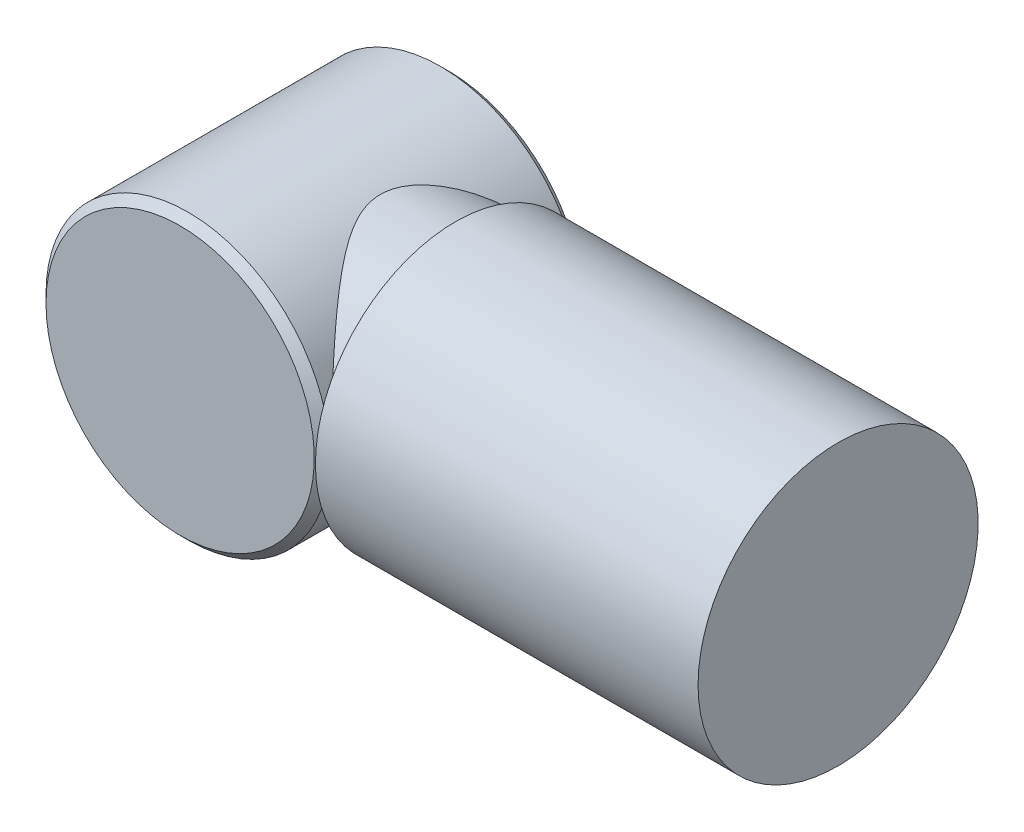
ISO-10303-21;
HEADER;
FILE_DESCRIPTION(('STEP AP214'),'2;1');
FILE_NAME('part.step','',(''),(''),'','','');
FILE_SCHEMA(('AUTOMOTIVE_DESIGN { 1 0 10303 214 1 1 1 1 }'));
ENDSEC;
DATA;
#1=APPLICATION_CONTEXT('core data for automotive mechanical design processes');
#2=APPLICATION_PROTOCOL_DEFINITION('international standard','automotive_design',2000,#1);
#3=PRODUCT_CONTEXT('',#1,'mechanical');
#4=PRODUCT('Part','Part','',(#3));
#5=PRODUCT_RELATED_PRODUCT_CATEGORY('part','',(#4));
#6=PRODUCT_DEFINITION_FORMATION('','',#4);
#7=PRODUCT_DEFINITION_CONTEXT('part definition',#1,'design');
#8=PRODUCT_DEFINITION('design','',#6,#7);
#9=PRODUCT_DEFINITION_SHAPE('','',#8);
#10=(LENGTH_UNIT() NAMED_UNIT(*) SI_UNIT(.MILLI.,.METRE.));
#11=(NAMED_UNIT(*) PLANE_ANGLE_UNIT() SI_UNIT($,.RADIAN.));
#12=(NAMED_UNIT(*) SI_UNIT($,.STERADIAN.) SOLID_ANGLE_UNIT());
#13=UNCERTAINTY_MEASURE_WITH_UNIT(LENGTH_MEASURE(1.E-05),#10,'distance_accuracy_value','');
#14=(GEOMETRIC_REPRESENTATION_CONTEXT(3) GLOBAL_UNCERTAINTY_ASSIGNED_CONTEXT((#13)) GLOBAL_UNIT_ASSIGNED_CONTEXT((#10,
#11,#12)) REPRESENTATION_CONTEXT('',''));
#15=CARTESIAN_POINT('',(0.,0.,0.));
#16=DIRECTION('',(0.,0.,1.));
#17=DIRECTION('',(1.,0.,0.));
#18=AXIS2_PLACEMENT_3D('',#15,#16,#17);
#19=CARTESIAN_POINT('',(0.,0.,-9.));
#20=DIRECTION('',(0.,0.,-1.));
#21=DIRECTION('',(-1.,0.,0.));
#22=AXIS2_PLACEMENT_3D('',#19,#20,#21);
#23=PLANE('',#22);
#24=CARTESIAN_POINT('',(0.,0.,-9.));
#25=DIRECTION('',(0.,0.,1.));
#26=DIRECTION('',(1.,0.,0.));
#27=AXIS2_PLACEMENT_3D('',#24,#25,#26);
#28=CIRCLE('',#27,14.5);
#29=CARTESIAN_POINT('',(14.5,0.,-9.));
#30=VERTEX_POINT('',#29);
#31=EDGE_CURVE('E20',#30,#30,#28,.T.);
#32=ORIENTED_EDGE('',*,*,#31,.F.);
#33=EDGE_LOOP('',(#32));
#34=FACE_BOUND('',#33,.T.);
#35=ADVANCED_FACE('F17',(#34),#23,.T.);
#36=CARTESIAN_POINT('',(0.,0.,-8.5));
#37=DIRECTION('',(0.,0.,1.));
#38=DIRECTION('',(1.,0.,0.));
#39=AXIS2_PLACEMENT_3D('',#36,#37,#38);
#40=CONICAL_SURFACE('',#39,15.,0.78539816339744);
#41=CARTESIAN_POINT('',(0.,0.,-8.5));
#42=DIRECTION('',(0.,0.,1.));
#43=DIRECTION('',(1.,0.,0.));
#44=AXIS2_PLACEMENT_3D('',#41,#42,#43);
#45=CIRCLE('',#44,15.);
#46=CARTESIAN_POINT('',(15.,0.,-8.5));
#47=VERTEX_POINT('',#46);
#48=EDGE_CURVE('E147',#47,#47,#45,.T.);
#49=ORIENTED_EDGE('',*,*,#48,.F.);
#50=EDGE_LOOP('',(#49));
#51=FACE_BOUND('',#50,.T.);
#52=ORIENTED_EDGE('',*,*,#31,.T.);
#53=EDGE_LOOP('',(#52));
#54=FACE_BOUND('',#53,.T.);
#55=ADVANCED_FACE('F188',(#51,#54),#40,.T.);
#56=CARTESIAN_POINT('',(0.,0.,-9.));
#57=DIRECTION('',(0.,0.,1.));
#58=DIRECTION('',(1.,0.,0.));
#59=AXIS2_PLACEMENT_3D('',#56,#57,#58);
#60=CYLINDRICAL_SURFACE('',#59,15.);
#61=CARTESIAN_POINT('',(0.,0.,-2.));
#62=DIRECTION('',(0.,0.,1.));
#63=DIRECTION('',(1.,0.,0.));
#64=AXIS2_PLACEMENT_3D('',#61,#62,#63);
#65=CIRCLE('',#64,15.);
#66=CARTESIAN_POINT('',(15.,0.,-2.));
#67=VERTEX_POINT('',#66);
#68=EDGE_CURVE('E145',#67,#67,#65,.T.);
#69=ORIENTED_EDGE('',*,*,#68,.F.);
#70=EDGE_LOOP('',(#69));
#71=FACE_BOUND('',#70,.T.);
#72=ORIENTED_EDGE('',*,*,#48,.T.);
#73=EDGE_LOOP('',(#72));
#74=FACE_BOUND('',#73,.T.);
#75=ADVANCED_FACE('F182',(#71,#74),#60,.T.);
#76=CARTESIAN_POINT('',(0.,0.,-2.));
#77=DIRECTION('',(0.,0.,-1.));
#78=DIRECTION('',(-1.,0.,0.));
#79=AXIS2_PLACEMENT_3D('',#76,#77,#78);
#80=PLANE('',#79);
#81=CARTESIAN_POINT('',(0.,0.,-2.));
#82=DIRECTION('',(0.,0.,-1.));
#83=DIRECTION('',(-1.,0.,0.));
#84=AXIS2_PLACEMENT_3D('',#81,#82,#83);
#85=CIRCLE('',#84,17.);
#86=CARTESIAN_POINT('',(-17.,0.,-2.));
#87=VERTEX_POINT('',#86);
#88=EDGE_CURVE('E143',#87,#87,#85,.F.);
#89=ORIENTED_EDGE('',*,*,#88,.F.);
#90=EDGE_LOOP('',(#89));
#91=FACE_BOUND('',#90,.T.);
#92=ORIENTED_EDGE('',*,*,#68,.T.);
#93=EDGE_LOOP('',(#92));
#94=FACE_BOUND('',#93,.T.);
#95=ADVANCED_FACE('F177',(#91,#94),#80,.T.);
#96=CARTESIAN_POINT('',(0.,0.,0.5));
#97=DIRECTION('',(0.,0.,-1.));
#98=DIRECTION('',(-1.,0.,0.));
#99=AXIS2_PLACEMENT_3D('',#96,#97,#98);
#100=CYLINDRICAL_SURFACE('',#99,17.);
#101=CARTESIAN_POINT('',(0.,0.,0.));
#102=DIRECTION('',(0.,0.,-1.));
#103=DIRECTION('',(-1.,0.,0.));
#104=AXIS2_PLACEMENT_3D('',#101,#102,#103);
#105=CIRCLE('',#104,17.);
#106=CARTESIAN_POINT('',(-17.,0.,0.));
#107=VERTEX_POINT('',#106);
#108=EDGE_CURVE('E140',#107,#107,#105,.T.);
#109=ORIENTED_EDGE('',*,*,#108,.T.);
#110=EDGE_LOOP('',(#109));
#111=FACE_BOUND('',#110,.T.);
#112=ORIENTED_EDGE('',*,*,#88,.T.);
#113=EDGE_LOOP('',(#112));
#114=FACE_BOUND('',#113,.T.);
#115=ADVANCED_FACE('F174',(#111,#114),#100,.T.);
#116=CARTESIAN_POINT('',(0.,0.,68.));
#117=DIRECTION('',(0.,0.,1.));
#118=DIRECTION('',(1.,0.,0.));
#119=AXIS2_PLACEMENT_3D('',#116,#117,#118);
#120=PLANE('',#119);
#121=CARTESIAN_POINT('',(0.,0.,68.));
#122=DIRECTION('',(0.,0.,-1.));
#123=DIRECTION('',(-1.,0.,0.));
#124=AXIS2_PLACEMENT_3D('',#121,#122,#123);
#125=CIRCLE('',#124,34.);
#126=CARTESIAN_POINT('',(-34.,0.,68.));
#127=VERTEX_POINT('',#126);
#128=EDGE_CURVE('E73',#127,#127,#125,.T.);
#129=ORIENTED_EDGE('',*,*,#128,.F.);
#130=EDGE_LOOP('',(#129));
#131=FACE_BOUND('',#130,.T.);
#132=ADVANCED_FACE('F171',(#131),#120,.T.);
#133=CARTESIAN_POINT('',(0.,0.,0.));
#134=DIRECTION('',(0.,0.,1.));
#135=DIRECTION('',(1.,0.,0.));
#136=AXIS2_PLACEMENT_3D('',#133,#134,#135);
#137=PLANE('',#136);
#138=CARTESIAN_POINT('',(0.,0.,0.));
#139=DIRECTION('',(0.,0.,1.));
#140=DIRECTION('',(1.,0.,0.));
#141=AXIS2_PLACEMENT_3D('',#138,#139,#140);
#142=CIRCLE('',#141,34.);
#143=CARTESIAN_POINT('',(34.,0.,0.));
#144=VERTEX_POINT('',#143);
#145=EDGE_CURVE('E137',#144,#144,#142,.T.);
#146=ORIENTED_EDGE('',*,*,#145,.F.);
#147=EDGE_LOOP('',(#146));
#148=FACE_BOUND('',#147,.T.);
#149=ORIENTED_EDGE('',*,*,#108,.F.);
#150=EDGE_LOOP('',(#149));
#151=FACE_BOUND('',#150,.T.);
#152=ADVANCED_FACE('F127',(#148,#151),#137,.F.);
#153=CARTESIAN_POINT('',(0.,0.,169.823376490863));
#154=DIRECTION('',(0.,0.,-1.));
#155=DIRECTION('',(-1.,0.,0.));
#156=AXIS2_PLACEMENT_3D('',#153,#154,#155);
#157=CYLINDRICAL_SURFACE('',#156,36.);
#158=CARTESIAN_POINT('',(35.5,-5.97913037155069,65.1364438192363));
#159=CARTESIAN_POINT('',(35.4310175256847,-6.38877942934124,65.0585419907403));
#160=CARTESIAN_POINT('',(35.3551676007641,-6.79575562975238,64.9728274435998));
#161=CARTESIAN_POINT('',(35.1902955634896,-7.60346750996772,64.7863128090172));
#162=CARTESIAN_POINT('',(35.1012756096363,-8.00420420052294,64.6855151935825));
#163=CARTESIAN_POINT('',(34.910734654101,-8.79812953910063,64.4694974063824));
#164=CARTESIAN_POINT('',(34.8092310478099,-9.19132782732697,64.3542973001972));
#165=CARTESIAN_POINT('',(34.5942468791537,-9.97002002836648,64.1099536847948));
#166=CARTESIAN_POINT('',(34.4807658668352,-10.3555136510921,63.9808096517441));
#167=CARTESIAN_POINT('',(34.1255412700314,-11.4923180458015,63.5758984652346));
#168=CARTESIAN_POINT('',(33.8671564156666,-12.2316164565677,63.2805484972162));
#169=CARTESIAN_POINT('',(33.310991166398,-13.6739136067002,62.6421267027277));
#170=CARTESIAN_POINT('',(33.0131975563298,-14.3769000589396,62.2990388660503));
#171=CARTESIAN_POINT('',(32.3853082141862,-15.740129382208,61.571878941208));
#172=CARTESIAN_POINT('',(32.0554086837098,-16.4005953861549,61.1880546337645));
#173=CARTESIAN_POINT('',(31.3669474567568,-17.6817276213,60.3820040555234));
#174=CARTESIAN_POINT('',(31.008388170533,-18.3023971914376,59.9597810136048));
#175=CARTESIAN_POINT('',(30.2663927569661,-19.5050257024758,59.0793396058032));
#176=CARTESIAN_POINT('',(29.8828922785005,-20.0868759710964,58.6210274280811));
#177=CARTESIAN_POINT('',(29.0965223974903,-21.2099597973596,57.6724420287199));
#178=CARTESIAN_POINT('',(28.6936517695677,-21.7511907798182,57.1821667843602));
#179=CARTESIAN_POINT('',(27.7974055809081,-22.8893215606762,56.078956081794));
#180=CARTESIAN_POINT('',(27.301034057999,-23.4780974155388,55.4600672711468));
#181=CARTESIAN_POINT('',(26.2949084696467,-24.5997035387288,54.183571959859));
#182=CARTESIAN_POINT('',(25.7851520103493,-25.1325237131847,53.5259585069402));
#183=CARTESIAN_POINT('',(24.7603652159167,-26.1427206875148,52.1735103097067));
#184=CARTESIAN_POINT('',(24.2453353897664,-26.620102784384,51.4786791307552));
#185=CARTESIAN_POINT('',(23.2191743204786,-27.5197191419385,50.0516546163484));
#186=CARTESIAN_POINT('',(22.7080421884141,-27.9419663540659,49.3194701117676));
#187=CARTESIAN_POINT('',(21.8390252814642,-28.6229452573275,48.0215556129766));
#188=CARTESIAN_POINT('',(21.4774902752872,-28.8947978643374,47.4651232319967));
#189=CARTESIAN_POINT('',(20.7682338891007,-29.4087079465983,46.329974990839));
#190=CARTESIAN_POINT('',(20.4205135176079,-29.6507632492387,45.751257509822));
#191=CARTESIAN_POINT('',(19.7464865935054,-30.1038357563882,44.5700840329225));
#192=CARTESIAN_POINT('',(19.4201653337671,-30.3148744044293,43.9676448060274));
#193=CARTESIAN_POINT('',(18.7985689443437,-30.7042074480077,42.7370605676549));
#194=CARTESIAN_POINT('',(18.5032819779048,-30.8825143472396,42.1089254847266));
#195=CARTESIAN_POINT('',(17.8569909915881,-31.2620221478731,40.591827505797));
#196=CARTESIAN_POINT('',(17.5244343516389,-31.4481974628081,39.6906618651252));
#197=CARTESIAN_POINT('',(17.1173827498374,-31.6704822512879,38.3042541845783));
#198=CARTESIAN_POINT('',(16.9970740888855,-31.7350429909425,37.8368483236021));
#199=CARTESIAN_POINT('',(16.7921151588252,-31.8439684043953,36.8918152667395));
#200=CARTESIAN_POINT('',(16.7074626596727,-31.8883343412515,36.41418871205));
#201=CARTESIAN_POINT('',(16.5775359613401,-31.9560770888207,35.4457625869716));
#202=CARTESIAN_POINT('',(16.532781979815,-31.9791767417786,34.9548726052989));
#203=CARTESIAN_POINT('',(16.4873148709023,-32.0026425818751,33.9705112955261));
#204=CARTESIAN_POINT('',(16.4865983159504,-32.0030105382893,33.477040171314));
#205=CARTESIAN_POINT('',(16.5292646257073,-31.9809936671907,32.4921537476757));
#206=CARTESIAN_POINT('',(16.5726831175674,-31.958590458102,32.00074043116));
#207=CARTESIAN_POINT('',(16.7009557776369,-31.8917419970454,31.0248972799066));
#208=CARTESIAN_POINT('',(16.7858179915253,-31.8472924650873,30.540468819982));
#209=CARTESIAN_POINT('',(17.0100243960704,-31.7281856756891,29.4998150265092));
#210=CARTESIAN_POINT('',(17.1562152094622,-31.6496557717849,28.9455207655258));
#211=CARTESIAN_POINT('',(17.4900981784619,-31.4663720541779,27.8541475569318));
#212=CARTESIAN_POINT('',(17.6778024711394,-31.3616105701048,27.3170736966428));
#213=CARTESIAN_POINT('',(18.086562483714,-31.1276701080969,26.2594027434689));
#214=CARTESIAN_POINT('',(18.3077218187909,-30.9984149438643,25.7388631413465));
#215=CARTESIAN_POINT('',(18.7753964500439,-30.7174042561472,24.7154099462918));
#216=CARTESIAN_POINT('',(19.0219225885443,-30.5656390990644,24.212504014538));
#217=CARTESIAN_POINT('',(19.5107253741971,-30.2557040791972,23.2684986729692));
#218=CARTESIAN_POINT('',(19.7513547494737,-30.0993675210959,22.8259339512176));
#219=CARTESIAN_POINT('',(20.2444839013776,-29.7699308766384,21.9540061599194));
#220=CARTESIAN_POINT('',(20.496981503635,-29.5968338548432,21.5246406958036));
#221=CARTESIAN_POINT('',(21.0109690609056,-29.2341957130897,20.6779395932756));
#222=CARTESIAN_POINT('',(21.2724657795389,-29.0446420540856,20.2606134564911));
#223=CARTESIAN_POINT('',(21.801713995023,-28.6495087478457,19.4376724585315));
#224=CARTESIAN_POINT('',(22.0694657520972,-28.4439284330312,19.0320580861669));
#225=CARTESIAN_POINT('',(22.609403576665,-28.0166652201056,18.2315624922064));
#226=CARTESIAN_POINT('',(22.8815946926696,-27.7949628293564,17.8366950841467));
#227=CARTESIAN_POINT('',(23.4282689162089,-27.3357593910773,17.0578674099863));
#228=CARTESIAN_POINT('',(23.7027522055426,-27.0982570798007,16.67390801987));
#229=CARTESIAN_POINT('',(24.5269904759799,-26.3622605356405,15.5383561069369));
#230=CARTESIAN_POINT('',(25.077802118915,-25.8400669519655,14.8026974886068));
#231=CARTESIAN_POINT('',(26.2107072089075,-24.6920224453363,13.3224732275379));
#232=CARTESIAN_POINT('',(26.7921745947751,-24.061401842623,12.5811261927348));
#233=CARTESIAN_POINT('',(27.9339787226838,-22.7258629126223,11.1502139165205));
#234=CARTESIAN_POINT('',(28.4943105515283,-22.0209274527861,10.4606606786748));
#235=CARTESIAN_POINT('',(29.5813875928625,-20.5374241029562,9.13989668566544));
#236=CARTESIAN_POINT('',(30.1081928516126,-19.7589944313676,8.50858066006564));
#237=CARTESIAN_POINT('',(31.1176290417617,-18.1276619845829,7.31040280598437));
#238=CARTESIAN_POINT('',(31.6002834614057,-17.2747992852575,6.74350666677527));
#239=CARTESIAN_POINT('',(32.3733976191439,-15.762406561151,5.84190887236136));
#240=CARTESIAN_POINT('',(32.6781801159787,-15.1212960322564,5.48845512972165));
#241=CARTESIAN_POINT('',(33.2557942977883,-13.80466147985,4.82136198393556));
#242=CARTESIAN_POINT('',(33.5286250766065,-13.1291364811169,4.50772370994183));
#243=CARTESIAN_POINT('',(34.0371017992086,-11.748012780838,3.92510365565405));
#244=CARTESIAN_POINT('',(34.2728486302512,-11.0425025464646,3.65600060905108));
#245=CARTESIAN_POINT('',(34.7035963647316,-9.60332116437578,3.16553816809375));
#246=CARTESIAN_POINT('',(34.8986239167895,-8.86966880874604,2.9441475453994));
#247=CARTESIAN_POINT('',(35.1529937718316,-7.77163262604167,2.65592092800518));
#248=CARTESIAN_POINT('',(35.2296867047558,-7.4163469793477,2.56911074171488));
#249=CARTESIAN_POINT('',(35.372699989775,-6.70112422030838,2.40735998468529));
#250=CARTESIAN_POINT('',(35.4390231165455,-6.34118838022966,2.33241623874365));
#251=CARTESIAN_POINT('',(35.5,-5.97913037155071,2.26355618076371));
#252=B_SPLINE_CURVE_WITH_KNOTS('',3,(#158,#159,#160,#161,#162,#163,#164,#165,#166,#167,#168,
#169,#170,#171,#172,#173,#174,#175,#176,#177,#178,#179,#180,#181,#182,#183,#184,#185,#186,#187,
#188,#189,#190,#191,#192,#193,#194,#195,#196,#197,#198,#199,#200,#201,#202,#203,#204,#205,#206,
#207,#208,#209,#210,#211,#212,#213,#214,#215,#216,#217,#218,#219,#220,#221,#222,#223,#224,#225,
#226,#227,#228,#229,#230,#231,#232,#233,#234,#235,#236,#237,#238,#239,#240,#241,#242,#243,#244,
#245,#246,#247,#248,#249,#250,#251),.UNSPECIFIED.,.F.,.F.,(4,2,2,2,2,2,2,2,2,2,2,2,2,2,2,2,2,2,
2,2,2,2,2,2,2,2,2,2,2,2,2,2,2,2,2,2,2,2,2,2,2,2,2,2,2,2,4),(0.,1.26779220495994,
2.53537685493925,3.80121478237204,5.06710028029144,7.57447885947186,10.082700393051,
12.5764562300849,15.0700025653103,17.5702594731081,20.0706747586751,23.0319163998994,
25.9936913066267,28.9551829885647,31.9159777459346,34.0663141148165,36.2168071784007,
38.3658064217263,40.5139830202633,43.4387299464792,44.8980560125976,46.3572907945042,
47.835284766322,49.3131637013193,50.7922365732341,52.2715966992404,54.0046060167127,
55.7381226760426,57.4771225841751,59.2168688908478,60.7986201977461,62.3800828340691,
63.9627612140806,65.5455055546616,67.1301964153601,68.7150141793066,71.8830948335145,
75.2807823023488,78.6792547942322,82.071458577568,85.4618470834796,87.8387322867138,
90.2156848825223,92.5860547409414,94.9548684208563,96.0756330533994,97.196097284958),.UNSPECIFIED.);
#253=CARTESIAN_POINT('',(35.5,-5.9791303715507,65.1364438192363));
#254=VERTEX_POINT('',#253);
#255=CARTESIAN_POINT('',(35.5,-5.9791303715507,2.2635561807637));
#256=VERTEX_POINT('',#255);
#257=EDGE_CURVE('E75',#254,#256,#252,.T.);
#258=ORIENTED_EDGE('',*,*,#257,.F.);
#259=DIRECTION('',(0.,0.,-1.));
#260=VECTOR('',#259,1.);
#261=CARTESIAN_POINT('',(35.5,-5.9791303715507,169.823376490863));
#262=LINE('',#261,#260);
#263=CARTESIAN_POINT('',(35.5,-5.9791303715507,66.));
#264=VERTEX_POINT('',#263);
#265=EDGE_CURVE('E68',#254,#264,#262,.F.);
#266=ORIENTED_EDGE('',*,*,#265,.T.);
#267=CARTESIAN_POINT('',(0.,0.,66.));
#268=DIRECTION('',(0.,0.,-1.));
#269=DIRECTION('',(-1.,0.,0.));
#270=AXIS2_PLACEMENT_3D('',#267,#268,#269);
#271=CIRCLE('',#270,36.);
#272=CARTESIAN_POINT('',(35.5,5.9791303715507,66.));
#273=VERTEX_POINT('',#272);
#274=EDGE_CURVE('E64',#273,#264,#271,.F.);
#275=ORIENTED_EDGE('',*,*,#274,.F.);
#276=DIRECTION('',(0.,0.,-1.));
#277=VECTOR('',#276,1.);
#278=CARTESIAN_POINT('',(35.5,5.97913037155071,169.823376490863));
#279=LINE('',#278,#277);
#280=CARTESIAN_POINT('',(35.5,5.9791303715507,65.1364438192363));
#281=VERTEX_POINT('',#280);
#282=EDGE_CURVE('E56',#273,#281,#279,.T.);
#283=ORIENTED_EDGE('',*,*,#282,.T.);
#284=CARTESIAN_POINT('',(35.5,5.9791303715507,2.2635561807637));
#285=CARTESIAN_POINT('',(35.4310175256847,6.38877942934125,2.3414580092597));
#286=CARTESIAN_POINT('',(35.3551676007641,6.79575562975238,2.42717255640025));
#287=CARTESIAN_POINT('',(35.1902955634896,7.60346750996773,2.6136871909828));
#288=CARTESIAN_POINT('',(35.1012756096363,8.00420420052294,2.71448480641752));
#289=CARTESIAN_POINT('',(34.910734654101,8.79812953910064,2.93050259361756));
#290=CARTESIAN_POINT('',(34.8092310478099,9.19132782732697,3.04570269980284));
#291=CARTESIAN_POINT('',(34.5942468791537,9.97002002836648,3.29004631520519));
#292=CARTESIAN_POINT('',(34.4807658668352,10.3555136510921,3.41919034825594));
#293=CARTESIAN_POINT('',(34.1255412700314,11.4923180458015,3.82410153476537));
#294=CARTESIAN_POINT('',(33.8671564156666,12.2316164565677,4.11945150278379));
#295=CARTESIAN_POINT('',(33.310991166398,13.6739136067003,4.75787329727234));
#296=CARTESIAN_POINT('',(33.0131975563298,14.3769000589396,5.10096113394967));
#297=CARTESIAN_POINT('',(32.3853082141862,15.740129382208,5.82812105879203));
#298=CARTESIAN_POINT('',(32.0554086837098,16.4005953861549,6.21194536623546));
#299=CARTESIAN_POINT('',(31.3669474567568,17.6817276213,7.0179959444766));
#300=CARTESIAN_POINT('',(31.008388170533,18.3023971914376,7.44021898639517));
#301=CARTESIAN_POINT('',(30.2663927569661,19.5050257024758,8.32066039419685));
#302=CARTESIAN_POINT('',(29.8828922785005,20.0868759710964,8.77897257191887));
#303=CARTESIAN_POINT('',(29.0965223974903,21.2099597973596,9.72755797128009));
#304=CARTESIAN_POINT('',(28.6936517695677,21.7511907798182,10.2178332156398));
#305=CARTESIAN_POINT('',(27.7974055809081,22.8893215606762,11.321043918206));
#306=CARTESIAN_POINT('',(27.301034057999,23.4780974155388,11.9399327288533));
#307=CARTESIAN_POINT('',(26.2949084696467,24.5997035387288,13.216428040141));
#308=CARTESIAN_POINT('',(25.7851520103493,25.1325237131847,13.8740414930598));
#309=CARTESIAN_POINT('',(24.7603652159167,26.1427206875148,15.2264896902933));
#310=CARTESIAN_POINT('',(24.2453353897664,26.620102784384,15.9213208692448));
#311=CARTESIAN_POINT('',(23.2191743204786,27.5197191419385,17.3483453836516));
#312=CARTESIAN_POINT('',(22.7080421884141,27.9419663540659,18.0805298882324));
#313=CARTESIAN_POINT('',(21.8390252814642,28.6229452573275,19.3784443870234));
#314=CARTESIAN_POINT('',(21.4774902752872,28.8947978643374,19.9348767680033));
#315=CARTESIAN_POINT('',(20.7682338891007,29.4087079465983,21.070025009161));
#316=CARTESIAN_POINT('',(20.4205135176079,29.6507632492387,21.648742490178));
#317=CARTESIAN_POINT('',(19.7464865935054,30.1038357563882,22.8299159670775));
#318=CARTESIAN_POINT('',(19.4201653337671,30.3148744044293,23.4323551939726));
#319=CARTESIAN_POINT('',(18.7985689443437,30.7042074480077,24.6629394323451));
#320=CARTESIAN_POINT('',(18.5032819779048,30.8825143472396,25.2910745152734));
#321=CARTESIAN_POINT('',(17.8569909915881,31.2620221478731,26.808172494203));
#322=CARTESIAN_POINT('',(17.5244343516389,31.4481974628081,27.7093381348748));
#323=CARTESIAN_POINT('',(17.1173827498374,31.6704822512879,29.0957458154217));
#324=CARTESIAN_POINT('',(16.9970740888855,31.7350429909425,29.5631516763979));
#325=CARTESIAN_POINT('',(16.7921151588252,31.8439684043953,30.5081847332605));
#326=CARTESIAN_POINT('',(16.7074626596727,31.8883343412515,30.98581128795));
#327=CARTESIAN_POINT('',(16.5775359613401,31.9560770888207,31.9542374130284));
#328=CARTESIAN_POINT('',(16.5327819798151,31.9791767417786,32.4451273947011));
#329=CARTESIAN_POINT('',(16.4873148709023,32.0026425818751,33.4294887044739));
#330=CARTESIAN_POINT('',(16.4865983159504,32.0030105382893,33.922959828686));
#331=CARTESIAN_POINT('',(16.5292646257073,31.9809936671907,34.9078462523243));
#332=CARTESIAN_POINT('',(16.5726831175674,31.958590458102,35.39925956884));
#333=CARTESIAN_POINT('',(16.7009557776369,31.8917419970454,36.3751027200935));
#334=CARTESIAN_POINT('',(16.7858179915253,31.8472924650873,36.859531180018));
#335=CARTESIAN_POINT('',(17.0100243960704,31.7281856756891,37.9001849734908));
#336=CARTESIAN_POINT('',(17.1562152094623,31.6496557717849,38.4544792344742));
#337=CARTESIAN_POINT('',(17.4900981784619,31.4663720541779,39.5458524430682));
#338=CARTESIAN_POINT('',(17.6778024711394,31.3616105701048,40.0829263033572));
#339=CARTESIAN_POINT('',(18.086562483714,31.1276701080969,41.1405972565311));
#340=CARTESIAN_POINT('',(18.3077218187909,30.9984149438642,41.6611368586535));
#341=CARTESIAN_POINT('',(18.7753964500439,30.7174042561472,42.6845900537083));
#342=CARTESIAN_POINT('',(19.0219225885442,30.5656390990644,43.187495985462));
#343=CARTESIAN_POINT('',(19.5107253741971,30.2557040791972,44.1315013270309));
#344=CARTESIAN_POINT('',(19.7513547494737,30.0993675210959,44.5740660487825));
#345=CARTESIAN_POINT('',(20.2444839013776,29.7699308766383,45.4459938400806));
#346=CARTESIAN_POINT('',(20.496981503635,29.5968338548432,45.8753593041964));
#347=CARTESIAN_POINT('',(21.0109690609057,29.2341957130897,46.7220604067244));
#348=CARTESIAN_POINT('',(21.2724657795389,29.0446420540856,47.1393865435089));
#349=CARTESIAN_POINT('',(21.801713995023,28.6495087478457,47.9623275414685));
#350=CARTESIAN_POINT('',(22.0694657520972,28.4439284330312,48.3679419138331));
#351=CARTESIAN_POINT('',(22.609403576665,28.0166652201056,49.1684375077937));
#352=CARTESIAN_POINT('',(22.8815946926696,27.7949628293564,49.5633049158533));
#353=CARTESIAN_POINT('',(23.4282689162089,27.3357593910773,50.3421325900138));
#354=CARTESIAN_POINT('',(23.7027522055426,27.0982570798007,50.72609198013));
#355=CARTESIAN_POINT('',(24.52699047598,26.3622605356405,51.8616438930632));
#356=CARTESIAN_POINT('',(25.077802118915,25.8400669519655,52.5973025113933));
#357=CARTESIAN_POINT('',(26.2107072089076,24.6920224453363,54.0775267724621));
#358=CARTESIAN_POINT('',(26.7921745947751,24.0614018426229,54.8188738072652));
#359=CARTESIAN_POINT('',(27.9339787226838,22.7258629126223,56.2497860834796));
#360=CARTESIAN_POINT('',(28.4943105515283,22.0209274527861,56.9393393213252));
#361=CARTESIAN_POINT('',(29.5813875928625,20.5374241029561,58.2601033143346));
#362=CARTESIAN_POINT('',(30.1081928516126,19.7589944313676,58.8914193399344));
#363=CARTESIAN_POINT('',(31.1176290417617,18.1276619845829,60.0895971940157));
#364=CARTESIAN_POINT('',(31.6002834614058,17.2747992852575,60.6564933332248));
#365=CARTESIAN_POINT('',(32.3733976191439,15.762406561151,61.5580911276387));
#366=CARTESIAN_POINT('',(32.6781801159787,15.1212960322564,61.9115448702784));
#367=CARTESIAN_POINT('',(33.2557942977883,13.8046614798499,62.5786380160645));
#368=CARTESIAN_POINT('',(33.5286250766066,13.1291364811168,62.8922762900582));
#369=CARTESIAN_POINT('',(34.0371017992086,11.7480127808379,63.474896344346));
#370=CARTESIAN_POINT('',(34.2728486302512,11.0425025464645,63.7439993909489));
#371=CARTESIAN_POINT('',(34.7035963647317,9.60332116437574,64.2344618319063));
#372=CARTESIAN_POINT('',(34.8986239167896,8.869668808746,64.4558524546006));
#373=CARTESIAN_POINT('',(35.1529937718316,7.77163262604163,64.7440790719948));
#374=CARTESIAN_POINT('',(35.2296867047558,7.41634697934767,64.8308892582851));
#375=CARTESIAN_POINT('',(35.372699989775,6.70112422030836,64.9926400153147));
#376=CARTESIAN_POINT('',(35.4390231165455,6.34118838022965,65.0675837612563));
#377=CARTESIAN_POINT('',(35.5,5.9791303715507,65.1364438192363));
#378=B_SPLINE_CURVE_WITH_KNOTS('',3,(#284,#285,#286,#287,#288,#289,#290,#291,#292,#293,#294,
#295,#296,#297,#298,#299,#300,#301,#302,#303,#304,#305,#306,#307,#308,#309,#310,#311,#312,#313,
#314,#315,#316,#317,#318,#319,#320,#321,#322,#323,#324,#325,#326,#327,#328,#329,#330,#331,#332,
#333,#334,#335,#336,#337,#338,#339,#340,#341,#342,#343,#344,#345,#346,#347,#348,#349,#350,#351,
#352,#353,#354,#355,#356,#357,#358,#359,#360,#361,#362,#363,#364,#365,#366,#367,#368,#369,#370,
#371,#372,#373,#374,#375,#376,#377),.UNSPECIFIED.,.F.,.F.,(4,2,2,2,2,2,2,2,2,2,2,2,2,2,2,2,2,2,
2,2,2,2,2,2,2,2,2,2,2,2,2,2,2,2,2,2,2,2,2,2,2,2,2,2,2,2,4),(0.,1.26779220495994,
2.53537685493924,3.80121478237203,5.06710028029144,7.57447885947186,10.082700393051,
12.5764562300849,15.0700025653103,17.5702594731081,20.0706747586751,23.0319163998994,
25.9936913066267,28.9551829885647,31.9159777459346,34.0663141148165,36.2168071784007,
38.3658064217263,40.5139830202632,43.4387299464792,44.8980560125976,46.3572907945042,
47.835284766322,49.3131637013193,50.7922365732341,52.2715966992404,54.0046060167127,
55.7381226760426,57.4771225841752,59.2168688908478,60.7986201977461,62.3800828340691,
63.9627612140806,65.5455055546616,67.1301964153602,68.7150141793067,71.8830948335145,
75.2807823023488,78.6792547942323,82.0714585775681,85.4618470834797,87.8387322867139,
90.2156848825223,92.5860547409414,94.9548684208563,96.0756330533994,97.1960972849581),.UNSPECIFIED.);
#379=CARTESIAN_POINT('',(35.5,5.97913037155071,2.26355618076371));
#380=VERTEX_POINT('',#379);
#381=EDGE_CURVE('E131',#380,#281,#378,.T.);
#382=ORIENTED_EDGE('',*,*,#381,.F.);
#383=DIRECTION('',(0.,0.,-1.));
#384=VECTOR('',#383,1.);
#385=CARTESIAN_POINT('',(35.5,5.97913037155071,169.823376490863));
#386=LINE('',#385,#384);
#387=CARTESIAN_POINT('',(35.5,5.97913037155072,2.00000000000003));
#388=VERTEX_POINT('',#387);
#389=EDGE_CURVE('E48',#380,#388,#386,.T.);
#390=ORIENTED_EDGE('',*,*,#389,.T.);
#391=CARTESIAN_POINT('',(0.,0.,2.00000000000002));
#392=DIRECTION('',(0.,0.,1.));
#393=DIRECTION('',(1.,0.,0.));
#394=AXIS2_PLACEMENT_3D('',#391,#392,#393);
#395=CIRCLE('',#394,36.);
#396=CARTESIAN_POINT('',(35.5,-5.9791303715507,2.00000000000002));
#397=VERTEX_POINT('',#396);
#398=EDGE_CURVE('E78',#397,#388,#395,.F.);
#399=ORIENTED_EDGE('',*,*,#398,.F.);
#400=DIRECTION('',(0.,0.,-1.));
#401=VECTOR('',#400,1.);
#402=CARTESIAN_POINT('',(35.5,-5.9791303715507,169.823376490863));
#403=LINE('',#402,#401);
#404=EDGE_CURVE('E35',#397,#256,#403,.F.);
#405=ORIENTED_EDGE('',*,*,#404,.T.);
#406=EDGE_LOOP('',(#258,#266,#275,#283,#382,#390,#399,#405));
#407=FACE_BOUND('',#406,.T.);
#408=ADVANCED_FACE('F76',(#407),#157,.T.);
#409=CARTESIAN_POINT('',(0.,0.,66.));
#410=DIRECTION('',(0.,0.,-1.));
#411=DIRECTION('',(-1.,0.,0.));
#412=AXIS2_PLACEMENT_3D('',#409,#410,#411);
#413=CONICAL_SURFACE('',#412,36.,0.785398163397455);
#414=ORIENTED_EDGE('',*,*,#274,.T.);
#415=CARTESIAN_POINT('',(35.5,-5.9791303715507,66.));
#416=CARTESIAN_POINT('',(35.5,-5.48366457658142,66.0823284869698));
#417=CARTESIAN_POINT('',(35.5,-4.98655269469394,66.1549096877676));
#418=CARTESIAN_POINT('',(35.5,-3.98975704094611,66.2799162636541));
#419=CARTESIAN_POINT('',(35.5,-3.49007302957082,66.3323397259561));
#420=CARTESIAN_POINT('',(35.5,-2.49241035756372,66.416063112833));
#421=CARTESIAN_POINT('',(35.5,-1.99444381111829,66.4475066515795));
#422=CARTESIAN_POINT('',(35.5,-0.997651481675149,66.4894745957984));
#423=CARTESIAN_POINT('',(35.5,-0.498825740837572,66.5));
#424=CARTESIAN_POINT('',(35.5,0.49882574083758,66.5));
#425=CARTESIAN_POINT('',(35.5,0.997651481675157,66.4894745957984));
#426=CARTESIAN_POINT('',(35.5,1.9944438111183,66.4475066515795));
#427=CARTESIAN_POINT('',(35.5,2.49241035756373,66.416063112833));
#428=CARTESIAN_POINT('',(35.5,3.49007302957083,66.3323397259561));
#429=CARTESIAN_POINT('',(35.5,3.98975704094612,66.2799162636541));
#430=CARTESIAN_POINT('',(35.5,4.98655269469395,66.1549096877676));
#431=CARTESIAN_POINT('',(35.5,5.48366457658143,66.0823284869698));
#432=CARTESIAN_POINT('',(35.5,5.9791303715507,66.));
#433=B_SPLINE_CURVE_WITH_KNOTS('',3,(#415,#416,#417,#418,#419,#420,#421,#422,#423,#424,#425,
#426,#427,#428,#429,#430,#431,#432),.UNSPECIFIED.,.F.,.F.,(4,2,2,2,2,2,2,2,4),(0.,
1.50671980593028,3.01358255065289,4.51002152382784,6.00638904832584,7.50275657282385,
8.99919554599879,10.5060582907214,12.0127780966517),.UNSPECIFIED.);
#434=EDGE_CURVE('E72',#264,#273,#433,.T.);
#435=ORIENTED_EDGE('',*,*,#434,.T.);
#436=EDGE_LOOP('',(#414,#435));
#437=FACE_BOUND('',#436,.T.);
#438=ORIENTED_EDGE('',*,*,#128,.T.);
#439=EDGE_LOOP('',(#438));
#440=FACE_BOUND('',#439,.T.);
#441=ADVANCED_FACE('F119',(#437,#440),#413,.T.);
#442=CARTESIAN_POINT('',(-35.001,0.,33.7));
#443=DIRECTION('',(1.,0.,0.));
#444=DIRECTION('',(0.,0.,-1.));
#445=AXIS2_PLACEMENT_3D('',#442,#443,#444);
#446=CYLINDRICAL_SURFACE('',#445,32.);
#447=CARTESIAN_POINT('',(35.5,0.,33.7));
#448=DIRECTION('',(1.,0.,0.));
#449=DIRECTION('',(0.,0.,-1.));
#450=AXIS2_PLACEMENT_3D('',#447,#448,#449);
#451=CIRCLE('',#450,32.);
#452=EDGE_CURVE('E86',#281,#380,#451,.F.);
#453=ORIENTED_EDGE('',*,*,#452,.T.);
#454=ORIENTED_EDGE('',*,*,#381,.T.);
#455=EDGE_LOOP('',(#453,#454));
#456=FACE_BOUND('',#455,.T.);
#457=ADVANCED_FACE('F122',(#456),#446,.T.);
#458=CARTESIAN_POINT('',(0.,0.,2.00000000000002));
#459=DIRECTION('',(0.,0.,1.));
#460=DIRECTION('',(1.,0.,0.));
#461=AXIS2_PLACEMENT_3D('',#458,#459,#460);
#462=CONICAL_SURFACE('',#461,36.,0.785398163397443);
#463=ORIENTED_EDGE('',*,*,#145,.T.);
#464=EDGE_LOOP('',(#463));
#465=FACE_BOUND('',#464,.T.);
#466=CARTESIAN_POINT('',(35.5,5.9791303715507,2.00000000000002));
#467=CARTESIAN_POINT('',(35.5,5.48366457658143,1.91767151303019));
#468=CARTESIAN_POINT('',(35.5,4.98655269469395,1.84509031223238));
#469=CARTESIAN_POINT('',(35.5,3.98975704094611,1.72008373634587));
#470=CARTESIAN_POINT('',(35.5,3.49007302957083,1.66766027404387));
#471=CARTESIAN_POINT('',(35.5,2.49241035756372,1.58393688716696));
#472=CARTESIAN_POINT('',(35.5,1.99444381111829,1.55249334842049));
#473=CARTESIAN_POINT('',(35.5,0.997651481675152,1.51052540420157));
#474=CARTESIAN_POINT('',(35.5,0.498825740837575,1.50000000000002));
#475=CARTESIAN_POINT('',(35.5,-0.498825740837578,1.50000000000002));
#476=CARTESIAN_POINT('',(35.5,-0.997651481675155,1.51052540420157));
#477=CARTESIAN_POINT('',(35.5,-1.99444381111829,1.55249334842049));
#478=CARTESIAN_POINT('',(35.5,-2.49241035756372,1.58393688716696));
#479=CARTESIAN_POINT('',(35.5,-3.49007302957083,1.66766027404387));
#480=CARTESIAN_POINT('',(35.5,-3.98975704094611,1.72008373634587));
#481=CARTESIAN_POINT('',(35.5,-4.98655269469395,1.84509031223238));
#482=CARTESIAN_POINT('',(35.5,-5.48366457658143,1.91767151303019));
#483=CARTESIAN_POINT('',(35.5,-5.9791303715507,2.00000000000002));
#484=B_SPLINE_CURVE_WITH_KNOTS('',3,(#466,#467,#468,#469,#470,#471,#472,#473,#474,#475,#476,
#477,#478,#479,#480,#481,#482,#483),.UNSPECIFIED.,.F.,.F.,(4,2,2,2,2,2,2,2,4),(0.,
1.50671980593028,3.0135825506529,4.51002152382784,6.00638904832585,7.50275657282385,
8.9991955459988,10.5060582907214,12.0127780966517),.UNSPECIFIED.);
#485=EDGE_CURVE('E81',#388,#397,#484,.T.);
#486=ORIENTED_EDGE('',*,*,#485,.T.);
#487=ORIENTED_EDGE('',*,*,#398,.T.);
#488=EDGE_LOOP('',(#486,#487));
#489=FACE_BOUND('',#488,.T.);
#490=ADVANCED_FACE('F96',(#465,#489),#462,.T.);
#491=CARTESIAN_POINT('',(-35.001,0.,33.7));
#492=DIRECTION('',(1.,0.,0.));
#493=DIRECTION('',(0.,0.,-1.));
#494=AXIS2_PLACEMENT_3D('',#491,#492,#493);
#495=CYLINDRICAL_SURFACE('',#494,32.);
#496=CARTESIAN_POINT('',(35.5,0.,33.7));
#497=DIRECTION('',(1.,0.,0.));
#498=DIRECTION('',(0.,0.,-1.));
#499=AXIS2_PLACEMENT_3D('',#496,#497,#498);
#500=CIRCLE('',#499,32.);
#501=EDGE_CURVE('E71',#256,#254,#500,.F.);
#502=ORIENTED_EDGE('',*,*,#501,.T.);
#503=ORIENTED_EDGE('',*,*,#257,.T.);
#504=EDGE_LOOP('',(#502,#503));
#505=FACE_BOUND('',#504,.T.);
#506=ADVANCED_FACE('F80',(#505),#495,.T.);
#507=CARTESIAN_POINT('',(132.5,0.,0.));
#508=DIRECTION('',(1.,0.,0.));
#509=DIRECTION('',(0.,0.,-1.));
#510=AXIS2_PLACEMENT_3D('',#507,#508,#509);
#511=PLANE('',#510);
#512=CARTESIAN_POINT('',(132.5,-1.11022302462516E-13,33.7));
#513=DIRECTION('',(-1.,0.,0.));
#514=DIRECTION('',(0.,0.,1.));
#515=AXIS2_PLACEMENT_3D('',#512,#513,#514);
#516=CIRCLE('',#515,35.5);
#517=CARTESIAN_POINT('',(132.5,-1.11022302462516E-13,69.2));
#518=VERTEX_POINT('',#517);
#519=EDGE_CURVE('E26',#518,#518,#516,.T.);
#520=ORIENTED_EDGE('',*,*,#519,.F.);
#521=EDGE_LOOP('',(#520));
#522=FACE_BOUND('',#521,.T.);
#523=ADVANCED_FACE('F105',(#522),#511,.T.);
#524=CARTESIAN_POINT('',(35.5,0.,0.));
#525=DIRECTION('',(1.,0.,0.));
#526=DIRECTION('',(0.,0.,-1.));
#527=AXIS2_PLACEMENT_3D('',#524,#525,#526);
#528=PLANE('',#527);
#529=CARTESIAN_POINT('',(35.5,-1.11022302462516E-13,33.7));
#530=DIRECTION('',(-1.,0.,0.));
#531=DIRECTION('',(0.,0.,1.));
#532=AXIS2_PLACEMENT_3D('',#529,#530,#531);
#533=CIRCLE('',#532,35.5);
#534=CARTESIAN_POINT('',(35.5,-1.11022302462516E-13,69.2));
#535=VERTEX_POINT('',#534);
#536=EDGE_CURVE('E11',#535,#535,#533,.F.);
#537=ORIENTED_EDGE('',*,*,#536,.F.);
#538=EDGE_LOOP('',(#537));
#539=FACE_BOUND('',#538,.T.);
#540=ORIENTED_EDGE('',*,*,#404,.F.);
#541=ORIENTED_EDGE('',*,*,#485,.F.);
#542=ORIENTED_EDGE('',*,*,#389,.F.);
#543=ORIENTED_EDGE('',*,*,#452,.F.);
#544=ORIENTED_EDGE('',*,*,#282,.F.);
#545=ORIENTED_EDGE('',*,*,#434,.F.);
#546=ORIENTED_EDGE('',*,*,#265,.F.);
#547=ORIENTED_EDGE('',*,*,#501,.F.);
#548=EDGE_LOOP('',(#540,#541,#542,#543,#544,#545,#546,#547));
#549=FACE_BOUND('',#548,.T.);
#550=ADVANCED_FACE('F69',(#539,#549),#528,.F.);
#551=CARTESIAN_POINT('',(132.5,-1.11022302462516E-13,33.7));
#552=DIRECTION('',(-1.,0.,0.));
#553=DIRECTION('',(0.,0.,1.));
#554=AXIS2_PLACEMENT_3D('',#551,#552,#553);
#555=CYLINDRICAL_SURFACE('',#554,35.5);
#556=ORIENTED_EDGE('',*,*,#519,.T.);
#557=EDGE_LOOP('',(#556));
#558=FACE_BOUND('',#557,.T.);
#559=ORIENTED_EDGE('',*,*,#536,.T.);
#560=EDGE_LOOP('',(#559));
#561=FACE_BOUND('',#560,.T.);
#562=ADVANCED_FACE('F104',(#558,#561),#555,.T.);
#563=CLOSED_SHELL('',(#35,#55,#75,#95,#115,#132,#152,#408,#441,#457,#490,#506,#523,#550,#562));
#564=MANIFOLD_SOLID_BREP('B1',#563);
#565=ADVANCED_BREP_SHAPE_REPRESENTATION('',(#18,#564),#14);
#566=SHAPE_DEFINITION_REPRESENTATION(#9,#565);
ENDSEC;
END-ISO-10303-21;
